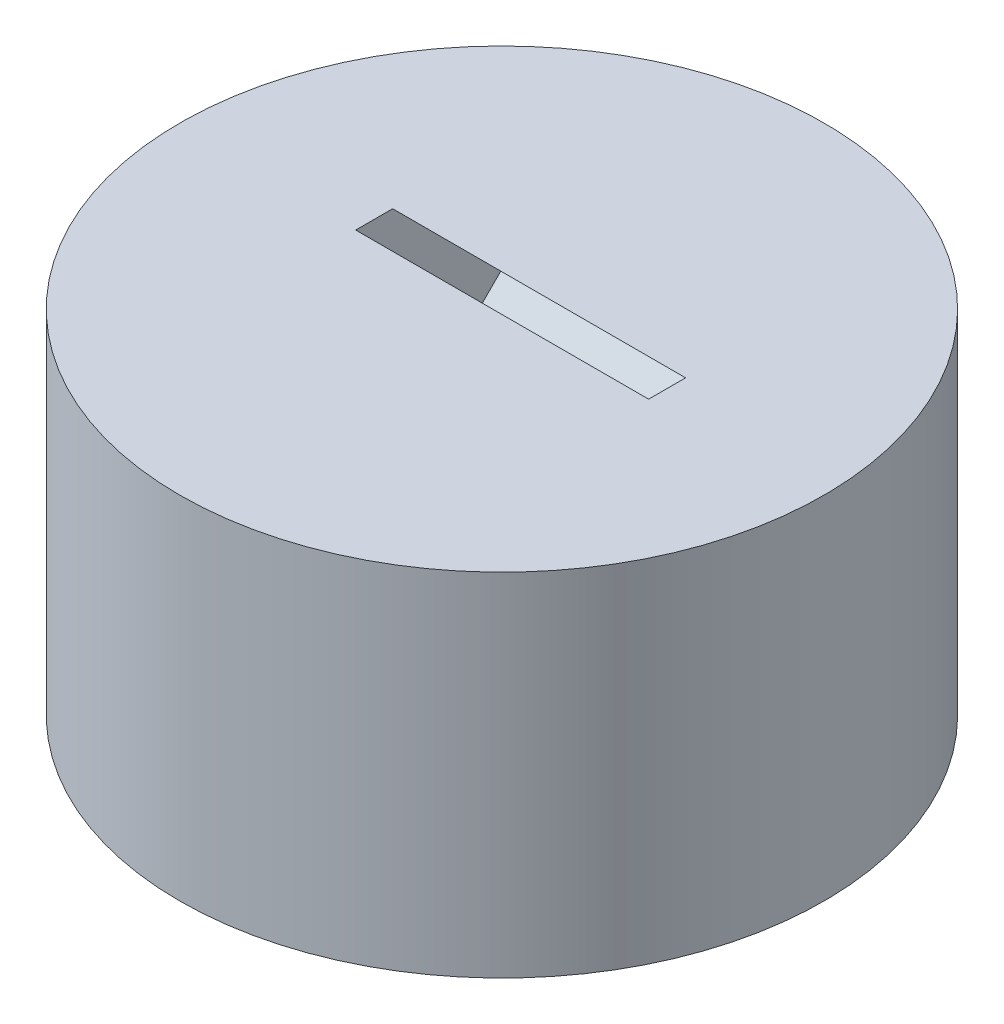
ISO-10303-21;
HEADER;
FILE_DESCRIPTION(('STEP AP214'),'2;1');
FILE_NAME('part.step','',(''),(''),'','','');
FILE_SCHEMA(('AUTOMOTIVE_DESIGN { 1 0 10303 214 1 1 1 1 }'));
ENDSEC;
DATA;
#1=APPLICATION_CONTEXT('core data for automotive mechanical design processes');
#2=APPLICATION_PROTOCOL_DEFINITION('international standard','automotive_design',2000,#1);
#3=PRODUCT_CONTEXT('',#1,'mechanical');
#4=PRODUCT('Part','Part','',(#3));
#5=PRODUCT_RELATED_PRODUCT_CATEGORY('part','',(#4));
#6=PRODUCT_DEFINITION_FORMATION('','',#4);
#7=PRODUCT_DEFINITION_CONTEXT('part definition',#1,'design');
#8=PRODUCT_DEFINITION('design','',#6,#7);
#9=PRODUCT_DEFINITION_SHAPE('','',#8);
#10=(LENGTH_UNIT() NAMED_UNIT(*) SI_UNIT(.MILLI.,.METRE.));
#11=(NAMED_UNIT(*) PLANE_ANGLE_UNIT() SI_UNIT($,.RADIAN.));
#12=(NAMED_UNIT(*) SI_UNIT($,.STERADIAN.) SOLID_ANGLE_UNIT());
#13=UNCERTAINTY_MEASURE_WITH_UNIT(LENGTH_MEASURE(1.E-05),#10,'distance_accuracy_value','');
#14=(GEOMETRIC_REPRESENTATION_CONTEXT(3) GLOBAL_UNCERTAINTY_ASSIGNED_CONTEXT((#13)) GLOBAL_UNIT_ASSIGNED_CONTEXT((#10,
#11,#12)) REPRESENTATION_CONTEXT('',''));
#15=CARTESIAN_POINT('',(0.,0.,0.));
#16=DIRECTION('',(0.,0.,1.));
#17=DIRECTION('',(1.,0.,0.));
#18=AXIS2_PLACEMENT_3D('',#15,#16,#17);
#19=CARTESIAN_POINT('',(0.,6.,0.));
#20=DIRECTION('',(0.,1.,0.));
#21=DIRECTION('',(0.,0.,1.));
#22=AXIS2_PLACEMENT_3D('',#19,#20,#21);
#23=PLANE('',#22);
#24=CARTESIAN_POINT('',(0.,6.,0.));
#25=DIRECTION('',(0.,1.,0.));
#26=DIRECTION('',(0.,0.,1.));
#27=AXIS2_PLACEMENT_3D('',#24,#25,#26);
#28=CIRCLE('',#27,5.5);
#29=CARTESIAN_POINT('',(0.,6.,5.5));
#30=VERTEX_POINT('',#29);
#31=EDGE_CURVE('E103',#30,#30,#28,.T.);
#32=ORIENTED_EDGE('',*,*,#31,.T.);
#33=EDGE_LOOP('',(#32));
#34=FACE_BOUND('',#33,.T.);
#35=DIRECTION('',(-1.,0.,0.));
#36=VECTOR('',#35,1.);
#37=CARTESIAN_POINT('',(0.,6.,0.079702672049926));
#38=LINE('',#37,#36);
#39=CARTESIAN_POINT('',(2.58355795090628,6.,0.0797026720499262));
#40=VERTEX_POINT('',#39);
#41=CARTESIAN_POINT('',(-2.41644204909372,6.,0.0797026720499271));
#42=VERTEX_POINT('',#41);
#43=EDGE_CURVE('E43',#40,#42,#38,.T.);
#44=ORIENTED_EDGE('',*,*,#43,.T.);
#45=DIRECTION('',(0.,0.,-1.));
#46=VECTOR('',#45,1.);
#47=CARTESIAN_POINT('',(-2.41644204909372,6.,0.));
#48=LINE('',#47,#46);
#49=CARTESIAN_POINT('',(-2.41644204909372,6.,-0.551355103154169));
#50=VERTEX_POINT('',#49);
#51=EDGE_CURVE('E11',#42,#50,#48,.T.);
#52=ORIENTED_EDGE('',*,*,#51,.T.);
#53=DIRECTION('',(1.,0.,0.));
#54=VECTOR('',#53,1.);
#55=CARTESIAN_POINT('',(0.,6.,-0.55135510315417));
#56=LINE('',#55,#54);
#57=CARTESIAN_POINT('',(2.58355795090628,6.,-0.55135510315417));
#58=VERTEX_POINT('',#57);
#59=EDGE_CURVE('E106',#50,#58,#56,.T.);
#60=ORIENTED_EDGE('',*,*,#59,.T.);
#61=DIRECTION('',(0.,0.,1.));
#62=VECTOR('',#61,1.);
#63=CARTESIAN_POINT('',(2.58355795090628,6.,0.));
#64=LINE('',#63,#62);
#65=EDGE_CURVE('E111',#58,#40,#64,.T.);
#66=ORIENTED_EDGE('',*,*,#65,.T.);
#67=EDGE_LOOP('',(#44,#52,#60,#66));
#68=FACE_BOUND('',#67,.T.);
#69=ADVANCED_FACE('F35',(#34,#68),#23,.T.);
#70=CARTESIAN_POINT('',(0.,6.,0.));
#71=DIRECTION('',(0.,-1.,0.));
#72=DIRECTION('',(0.,0.,-1.));
#73=AXIS2_PLACEMENT_3D('',#70,#71,#72);
#74=CYLINDRICAL_SURFACE('',#73,5.5);
#75=ORIENTED_EDGE('',*,*,#31,.F.);
#76=EDGE_LOOP('',(#75));
#77=FACE_BOUND('',#76,.T.);
#78=CARTESIAN_POINT('',(0.,0.,0.));
#79=DIRECTION('',(0.,1.,0.));
#80=DIRECTION('',(0.,0.,1.));
#81=AXIS2_PLACEMENT_3D('',#78,#79,#80);
#82=CIRCLE('',#81,5.5);
#83=CARTESIAN_POINT('',(0.,0.,5.5));
#84=VERTEX_POINT('',#83);
#85=EDGE_CURVE('E81',#84,#84,#82,.T.);
#86=ORIENTED_EDGE('',*,*,#85,.T.);
#87=EDGE_LOOP('',(#86));
#88=FACE_BOUND('',#87,.T.);
#89=ADVANCED_FACE('F37',(#77,#88),#74,.T.);
#90=CARTESIAN_POINT('',(0.,0.,0.));
#91=DIRECTION('',(0.,1.,0.));
#92=DIRECTION('',(0.,0.,1.));
#93=AXIS2_PLACEMENT_3D('',#90,#91,#92);
#94=PLANE('',#93);
#95=ORIENTED_EDGE('',*,*,#85,.F.);
#96=EDGE_LOOP('',(#95));
#97=FACE_BOUND('',#96,.T.);
#98=ADVANCED_FACE('F131',(#97),#94,.F.);
#99=CARTESIAN_POINT('',(-2.41644204909372,8.08146900753468,2.16117167958461));
#100=DIRECTION('',(1.,0.,0.));
#101=DIRECTION('',(0.,0.,-1.));
#102=AXIS2_PLACEMENT_3D('',#99,#100,#101);
#103=PLANE('',#102);
#104=DIRECTION('',(0.,-0.707106781186546,-0.707106781186549));
#105=VECTOR('',#104,1.);
#106=CARTESIAN_POINT('',(-2.41644204909372,8.08146900753468,2.16117167958461));
#107=LINE('',#106,#105);
#108=CARTESIAN_POINT('',(-2.41644204909372,3.8388283204154,-2.08146900753468));
#109=VERTEX_POINT('',#108);
#110=EDGE_CURVE('E73',#42,#109,#107,.T.);
#111=ORIENTED_EDGE('',*,*,#110,.T.);
#112=DIRECTION('',(0.,-0.707106781186549,0.707106781186547));
#113=VECTOR('',#112,1.);
#114=CARTESIAN_POINT('',(-2.41644204909372,3.8388283204154,-2.08146900753468));
#115=LINE('',#114,#113);
#116=CARTESIAN_POINT('',(-2.41644204909372,4.15435720801745,-2.39699789513673));
#117=VERTEX_POINT('',#116);
#118=EDGE_CURVE('E77',#117,#109,#115,.T.);
#119=ORIENTED_EDGE('',*,*,#118,.F.);
#120=DIRECTION('',(0.,-0.707106781186546,-0.707106781186549));
#121=VECTOR('',#120,1.);
#122=CARTESIAN_POINT('',(-2.41644204909372,8.39699789513672,1.84564279198256));
#123=LINE('',#122,#121);
#124=EDGE_CURVE('E99',#50,#117,#123,.T.);
#125=ORIENTED_EDGE('',*,*,#124,.F.);
#126=ORIENTED_EDGE('',*,*,#51,.F.);
#127=EDGE_LOOP('',(#111,#119,#125,#126));
#128=FACE_BOUND('',#127,.T.);
#129=ADVANCED_FACE('F75',(#128),#103,.T.);
#130=CARTESIAN_POINT('',(-2.41644204909372,8.08146900753468,2.16117167958461));
#131=DIRECTION('',(0.,0.707106781186549,-0.707106781186546));
#132=DIRECTION('',(0.,0.707106781186546,0.707106781186549));
#133=AXIS2_PLACEMENT_3D('',#130,#131,#132);
#134=PLANE('',#133);
#135=DIRECTION('',(0.,-0.707106781186546,-0.707106781186549));
#136=VECTOR('',#135,1.);
#137=CARTESIAN_POINT('',(2.58355795090628,8.08146900753468,2.16117167958461));
#138=LINE('',#137,#136);
#139=CARTESIAN_POINT('',(2.58355795090628,3.8388283204154,-2.08146900753468));
#140=VERTEX_POINT('',#139);
#141=EDGE_CURVE('E82',#40,#140,#138,.T.);
#142=ORIENTED_EDGE('',*,*,#141,.T.);
#143=DIRECTION('',(1.,0.,0.));
#144=VECTOR('',#143,1.);
#145=CARTESIAN_POINT('',(-2.41644204909372,3.8388283204154,-2.08146900753468));
#146=LINE('',#145,#144);
#147=EDGE_CURVE('E85',#109,#140,#146,.T.);
#148=ORIENTED_EDGE('',*,*,#147,.F.);
#149=ORIENTED_EDGE('',*,*,#110,.F.);
#150=ORIENTED_EDGE('',*,*,#43,.F.);
#151=EDGE_LOOP('',(#142,#148,#149,#150));
#152=FACE_BOUND('',#151,.T.);
#153=ADVANCED_FACE('F86',(#152),#134,.T.);
#154=CARTESIAN_POINT('',(2.58355795090628,8.08146900753468,2.16117167958461));
#155=DIRECTION('',(-1.,0.,0.));
#156=DIRECTION('',(0.,0.,1.));
#157=AXIS2_PLACEMENT_3D('',#154,#155,#156);
#158=PLANE('',#157);
#159=DIRECTION('',(0.,-0.707106781186546,-0.707106781186549));
#160=VECTOR('',#159,1.);
#161=CARTESIAN_POINT('',(2.58355795090628,8.39699789513672,1.84564279198256));
#162=LINE('',#161,#160);
#163=CARTESIAN_POINT('',(2.58355795090628,4.15435720801745,-2.39699789513673));
#164=VERTEX_POINT('',#163);
#165=EDGE_CURVE('E50',#58,#164,#162,.T.);
#166=ORIENTED_EDGE('',*,*,#165,.T.);
#167=DIRECTION('',(0.,0.707106781186549,-0.707106781186547));
#168=VECTOR('',#167,1.);
#169=CARTESIAN_POINT('',(2.58355795090628,3.8388283204154,-2.08146900753468));
#170=LINE('',#169,#168);
#171=EDGE_CURVE('E91',#140,#164,#170,.T.);
#172=ORIENTED_EDGE('',*,*,#171,.F.);
#173=ORIENTED_EDGE('',*,*,#141,.F.);
#174=ORIENTED_EDGE('',*,*,#65,.F.);
#175=EDGE_LOOP('',(#166,#172,#173,#174));
#176=FACE_BOUND('',#175,.T.);
#177=ADVANCED_FACE('F115',(#176),#158,.T.);
#178=CARTESIAN_POINT('',(-2.41644204909372,8.39699789513672,1.84564279198256));
#179=DIRECTION('',(0.,-0.707106781186549,0.707106781186546));
#180=DIRECTION('',(0.,-0.707106781186546,-0.707106781186549));
#181=AXIS2_PLACEMENT_3D('',#178,#179,#180);
#182=PLANE('',#181);
#183=ORIENTED_EDGE('',*,*,#124,.T.);
#184=DIRECTION('',(-1.,0.,0.));
#185=VECTOR('',#184,1.);
#186=CARTESIAN_POINT('',(-2.41644204909372,4.15435720801745,-2.39699789513673));
#187=LINE('',#186,#185);
#188=EDGE_CURVE('E94',#164,#117,#187,.T.);
#189=ORIENTED_EDGE('',*,*,#188,.F.);
#190=ORIENTED_EDGE('',*,*,#165,.F.);
#191=ORIENTED_EDGE('',*,*,#59,.F.);
#192=EDGE_LOOP('',(#183,#189,#190,#191));
#193=FACE_BOUND('',#192,.T.);
#194=ADVANCED_FACE('F116',(#193),#182,.T.);
#195=CARTESIAN_POINT('',(0.,0.878679656440355,0.878679656440356));
#196=DIRECTION('',(0.,-0.707106781186547,-0.707106781186549));
#197=DIRECTION('',(0.,0.707106781186549,-0.707106781186547));
#198=AXIS2_PLACEMENT_3D('',#195,#196,#197);
#199=PLANE('',#198);
#200=ORIENTED_EDGE('',*,*,#118,.T.);
#201=ORIENTED_EDGE('',*,*,#147,.T.);
#202=ORIENTED_EDGE('',*,*,#171,.T.);
#203=ORIENTED_EDGE('',*,*,#188,.T.);
#204=EDGE_LOOP('',(#200,#201,#202,#203));
#205=FACE_BOUND('',#204,.T.);
#206=ADVANCED_FACE('F93',(#205),#199,.F.);
#207=CLOSED_SHELL('',(#69,#89,#98,#129,#153,#177,#194,#206));
#208=MANIFOLD_SOLID_BREP('B2',#207);
#209=ADVANCED_BREP_SHAPE_REPRESENTATION('',(#18,#208),#14);
#210=SHAPE_DEFINITION_REPRESENTATION(#9,#209);
ENDSEC;
END-ISO-10303-21;
